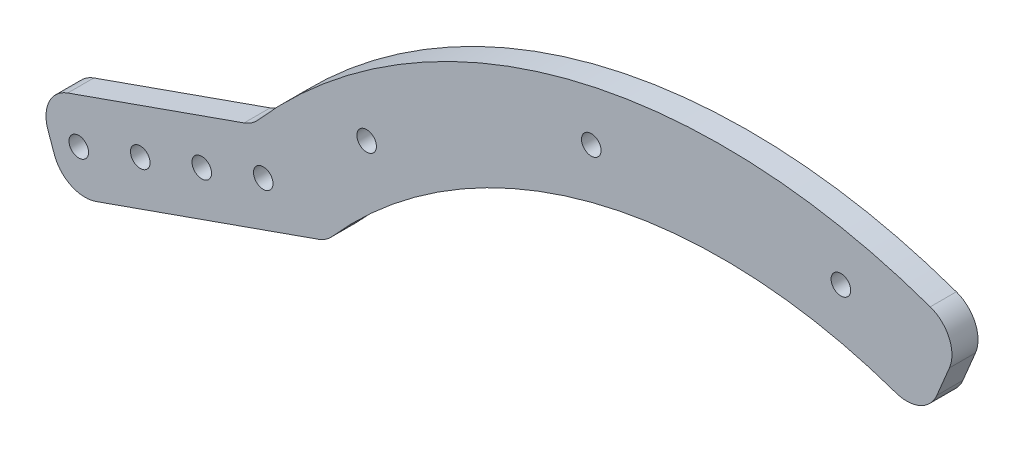
ISO-10303-21;
HEADER;
FILE_DESCRIPTION(('STEP AP214'),'2;1');
FILE_NAME('part.step','',(''),(''),'','','');
FILE_SCHEMA(('AUTOMOTIVE_DESIGN { 1 0 10303 214 1 1 1 1 }'));
ENDSEC;
DATA;
#1=APPLICATION_CONTEXT('core data for automotive mechanical design processes');
#2=APPLICATION_PROTOCOL_DEFINITION('international standard','automotive_design',2000,#1);
#3=PRODUCT_CONTEXT('',#1,'mechanical');
#4=PRODUCT('Part','Part','',(#3));
#5=PRODUCT_RELATED_PRODUCT_CATEGORY('part','',(#4));
#6=PRODUCT_DEFINITION_FORMATION('','',#4);
#7=PRODUCT_DEFINITION_CONTEXT('part definition',#1,'design');
#8=PRODUCT_DEFINITION('design','',#6,#7);
#9=PRODUCT_DEFINITION_SHAPE('','',#8);
#10=(LENGTH_UNIT() NAMED_UNIT(*) SI_UNIT(.MILLI.,.METRE.));
#11=(NAMED_UNIT(*) PLANE_ANGLE_UNIT() SI_UNIT($,.RADIAN.));
#12=(NAMED_UNIT(*) SI_UNIT($,.STERADIAN.) SOLID_ANGLE_UNIT());
#13=UNCERTAINTY_MEASURE_WITH_UNIT(LENGTH_MEASURE(1.E-05),#10,'distance_accuracy_value','');
#14=(GEOMETRIC_REPRESENTATION_CONTEXT(3) GLOBAL_UNCERTAINTY_ASSIGNED_CONTEXT((#13)) GLOBAL_UNIT_ASSIGNED_CONTEXT((#10,
#11,#12)) REPRESENTATION_CONTEXT('',''));
#15=CARTESIAN_POINT('',(0.,0.,0.));
#16=DIRECTION('',(0.,0.,1.));
#17=DIRECTION('',(1.,0.,0.));
#18=AXIS2_PLACEMENT_3D('',#15,#16,#17);
#19=CARTESIAN_POINT('',(-220.823144232662,61.9996075321783,8.));
#20=DIRECTION('',(0.942990333582889,0.332820117735138,0.));
#21=DIRECTION('',(-0.332820117735138,0.942990333582889,0.));
#22=AXIS2_PLACEMENT_3D('',#19,#20,#21);
#23=PLANE('',#22);
#24=DIRECTION('',(0.332820117735138,-0.942990333582889,0.));
#25=VECTOR('',#24,1.);
#26=CARTESIAN_POINT('',(-220.823144232662,61.9996075321783,0.));
#27=LINE('',#26,#25);
#28=CARTESIAN_POINT('',(-217.494943055311,52.5697041963494,0.));
#29=VERTEX_POINT('',#28);
#30=CARTESIAN_POINT('',(-215.504425104539,46.9299033358288,0.));
#31=VERTEX_POINT('',#30);
#32=EDGE_CURVE('E217',#29,#31,#27,.T.);
#33=ORIENTED_EDGE('',*,*,#32,.T.);
#34=DIRECTION('',(0.,0.,-1.));
#35=VECTOR('',#34,1.);
#36=CARTESIAN_POINT('',(-215.504425104539,46.9299033358288,8.));
#37=LINE('',#36,#35);
#38=CARTESIAN_POINT('',(-215.504425104539,46.9299033358288,8.));
#39=VERTEX_POINT('',#38);
#40=EDGE_CURVE('E196',#31,#39,#37,.F.);
#41=ORIENTED_EDGE('',*,*,#40,.T.);
#42=DIRECTION('',(0.332820117735138,-0.942990333582889,0.));
#43=VECTOR('',#42,1.);
#44=CARTESIAN_POINT('',(-220.823144232662,61.9996075321783,8.));
#45=LINE('',#44,#43);
#46=CARTESIAN_POINT('',(-217.494943055311,52.5697041963494,8.));
#47=VERTEX_POINT('',#46);
#48=EDGE_CURVE('E161',#47,#39,#45,.T.);
#49=ORIENTED_EDGE('',*,*,#48,.F.);
#50=DIRECTION('',(0.,0.,-1.));
#51=VECTOR('',#50,1.);
#52=CARTESIAN_POINT('',(-217.494943055311,52.5697041963494,8.));
#53=LINE('',#52,#51);
#54=EDGE_CURVE('E193',#47,#29,#53,.T.);
#55=ORIENTED_EDGE('',*,*,#54,.T.);
#56=EDGE_LOOP('',(#33,#41,#49,#55));
#57=FACE_BOUND('',#56,.T.);
#58=ADVANCED_FACE('F35',(#57),#23,.F.);
#59=CARTESIAN_POINT('',(-132.022045572642,65.7897100074866,8.));
#60=DIRECTION('',(-0.332820117735137,0.94299033358289,0.));
#61=DIRECTION('',(-0.94299033358289,-0.332820117735137,0.));
#62=AXIS2_PLACEMENT_3D('',#59,#60,#61);
#63=PLANE('',#62);
#64=DIRECTION('',(0.94299033358289,0.332820117735137,0.));
#65=VECTOR('',#64,1.);
#66=CARTESIAN_POINT('',(-132.022045572642,65.7897100074866,8.));
#67=LINE('',#66,#65);
#68=CARTESIAN_POINT('',(-202.746320591359,40.8282011773513,8.));
#69=VERTEX_POINT('',#68);
#70=CARTESIAN_POINT('',(-134.507826357793,64.9123756127273,8.));
#71=VERTEX_POINT('',#70);
#72=EDGE_CURVE('E235',#69,#71,#67,.T.);
#73=ORIENTED_EDGE('',*,*,#72,.F.);
#74=DIRECTION('',(0.,0.,-1.));
#75=VECTOR('',#74,1.);
#76=CARTESIAN_POINT('',(-202.746320591359,40.8282011773513,8.));
#77=LINE('',#76,#75);
#78=CARTESIAN_POINT('',(-202.746320591359,40.8282011773513,0.));
#79=VERTEX_POINT('',#78);
#80=EDGE_CURVE('E190',#69,#79,#77,.T.);
#81=ORIENTED_EDGE('',*,*,#80,.T.);
#82=DIRECTION('',(0.94299033358289,0.332820117735137,0.));
#83=VECTOR('',#82,1.);
#84=CARTESIAN_POINT('',(-132.022045572642,65.7897100074866,0.));
#85=LINE('',#84,#83);
#86=CARTESIAN_POINT('',(-134.507826357793,64.9123756127273,0.));
#87=VERTEX_POINT('',#86);
#88=EDGE_CURVE('E156',#79,#87,#85,.T.);
#89=ORIENTED_EDGE('',*,*,#88,.T.);
#90=DIRECTION('',(0.,0.,-1.));
#91=VECTOR('',#90,1.);
#92=CARTESIAN_POINT('',(-134.507826357793,64.9123756127273,8.));
#93=LINE('',#92,#91);
#94=EDGE_CURVE('E188',#87,#71,#93,.F.);
#95=ORIENTED_EDGE('',*,*,#94,.T.);
#96=EDGE_LOOP('',(#73,#81,#89,#95));
#97=FACE_BOUND('',#96,.T.);
#98=ADVANCED_FACE('F225',(#97),#63,.F.);
#99=CARTESIAN_POINT('',(-10.4659105901456,-38.2492540786534,8.));
#100=DIRECTION('',(0.,0.,-1.));
#101=DIRECTION('',(-1.,0.,0.));
#102=AXIS2_PLACEMENT_3D('',#99,#100,#101);
#103=CYLINDRICAL_SURFACE('',#102,160.);
#104=CARTESIAN_POINT('',(-10.4659105901456,-38.2492540786534,0.));
#105=DIRECTION('',(0.,0.,-1.));
#106=DIRECTION('',(1.,0.,0.));
#107=AXIS2_PLACEMENT_3D('',#104,#105,#106);
#108=CIRCLE('',#107,160.);
#109=CARTESIAN_POINT('',(-130.343667714851,67.7192475940144,0.));
#110=VERTEX_POINT('',#109);
#111=CARTESIAN_POINT('',(42.5977902386086,112.695251135536,0.));
#112=VERTEX_POINT('',#111);
#113=EDGE_CURVE('E151',#110,#112,#108,.T.);
#114=ORIENTED_EDGE('',*,*,#113,.T.);
#115=DIRECTION('',(0.,0.,-1.));
#116=VECTOR('',#115,1.);
#117=CARTESIAN_POINT('',(42.5977902386086,112.695251135536,8.));
#118=LINE('',#117,#116);
#119=CARTESIAN_POINT('',(42.5977902386086,112.695251135536,8.));
#120=VERTEX_POINT('',#119);
#121=EDGE_CURVE('E129',#112,#120,#118,.F.);
#122=ORIENTED_EDGE('',*,*,#121,.T.);
#123=CARTESIAN_POINT('',(-10.4659105901456,-38.2492540786534,8.));
#124=DIRECTION('',(0.,0.,-1.));
#125=DIRECTION('',(1.,0.,0.));
#126=AXIS2_PLACEMENT_3D('',#123,#124,#125);
#127=CIRCLE('',#126,160.);
#128=CARTESIAN_POINT('',(-130.343667714851,67.7192475940144,8.));
#129=VERTEX_POINT('',#128);
#130=EDGE_CURVE('E234',#129,#120,#127,.T.);
#131=ORIENTED_EDGE('',*,*,#130,.F.);
#132=DIRECTION('',(0.,0.,-1.));
#133=VECTOR('',#132,1.);
#134=CARTESIAN_POINT('',(-130.343667714851,67.7192475940144,8.));
#135=LINE('',#134,#133);
#136=EDGE_CURVE('E134',#129,#110,#135,.T.);
#137=ORIENTED_EDGE('',*,*,#136,.T.);
#138=EDGE_LOOP('',(#114,#122,#131,#137));
#139=FACE_BOUND('',#138,.T.);
#140=ADVANCED_FACE('F237',(#139),#103,.F.);
#141=CARTESIAN_POINT('',(51.3849935154415,109.312481006434,8.));
#142=DIRECTION('',(-0.922260844281795,0.386568150659919,0.));
#143=DIRECTION('',(-0.386568150659919,-0.922260844281795,0.));
#144=AXIS2_PLACEMENT_3D('',#141,#142,#143);
#145=PLANE('',#144);
#146=DIRECTION('',(0.386568150659919,0.922260844281795,0.));
#147=VECTOR('',#146,1.);
#148=CARTESIAN_POINT('',(51.3849935154415,109.312481006434,8.));
#149=LINE('',#148,#147);
#150=CARTESIAN_POINT('',(55.1368799832237,118.263601204824,8.));
#151=VERTEX_POINT('',#150);
#152=CARTESIAN_POINT('',(59.0088935037096,127.501316346068,8.));
#153=VERTEX_POINT('',#152);
#154=EDGE_CURVE('E144',#151,#153,#149,.T.);
#155=ORIENTED_EDGE('',*,*,#154,.F.);
#156=DIRECTION('',(0.,0.,-1.));
#157=VECTOR('',#156,1.);
#158=CARTESIAN_POINT('',(55.1368799832237,118.263601204824,8.));
#159=LINE('',#158,#157);
#160=CARTESIAN_POINT('',(55.1368799832237,118.263601204824,0.));
#161=VERTEX_POINT('',#160);
#162=EDGE_CURVE('E128',#151,#161,#159,.T.);
#163=ORIENTED_EDGE('',*,*,#162,.T.);
#164=DIRECTION('',(0.386568150659919,0.922260844281795,0.));
#165=VECTOR('',#164,1.);
#166=CARTESIAN_POINT('',(51.3849935154415,109.312481006434,0.));
#167=LINE('',#166,#165);
#168=CARTESIAN_POINT('',(59.0088935037096,127.501316346068,0.));
#169=VERTEX_POINT('',#168);
#170=EDGE_CURVE('E141',#161,#169,#167,.T.);
#171=ORIENTED_EDGE('',*,*,#170,.T.);
#172=DIRECTION('',(0.,0.,-1.));
#173=VECTOR('',#172,1.);
#174=CARTESIAN_POINT('',(59.0088935037096,127.501316346068,8.));
#175=LINE('',#174,#173);
#176=EDGE_CURVE('E146',#169,#153,#175,.F.);
#177=ORIENTED_EDGE('',*,*,#176,.T.);
#178=EDGE_LOOP('',(#155,#163,#171,#177));
#179=FACE_BOUND('',#178,.T.);
#180=ADVANCED_FACE('F140',(#179),#145,.F.);
#181=CARTESIAN_POINT('',(-10.4659105901456,-38.2492540786534,8.));
#182=DIRECTION('',(0.,0.,-1.));
#183=DIRECTION('',(-1.,0.,0.));
#184=AXIS2_PLACEMENT_3D('',#181,#182,#183);
#185=CYLINDRICAL_SURFACE('',#184,190.);
#186=CARTESIAN_POINT('',(-10.4659105901456,-38.2492540786534,8.));
#187=DIRECTION('',(0.,0.,1.));
#188=DIRECTION('',(1.,0.,0.));
#189=AXIS2_PLACEMENT_3D('',#186,#187,#188);
#190=CIRCLE('',#189,190.);
#191=CARTESIAN_POINT('',(53.133629263727,140.790122959963,8.));
#192=VERTEX_POINT('',#191);
#193=CARTESIAN_POINT('',(-153.125685299723,87.2425332216027,8.));
#194=VERTEX_POINT('',#193);
#195=EDGE_CURVE('E212',#192,#194,#190,.T.);
#196=ORIENTED_EDGE('',*,*,#195,.F.);
#197=DIRECTION('',(0.,0.,-1.));
#198=VECTOR('',#197,1.);
#199=CARTESIAN_POINT('',(53.133629263727,140.790122959963,8.));
#200=LINE('',#199,#198);
#201=CARTESIAN_POINT('',(53.133629263727,140.790122959963,0.));
#202=VERTEX_POINT('',#201);
#203=EDGE_CURVE('E185',#192,#202,#200,.T.);
#204=ORIENTED_EDGE('',*,*,#203,.T.);
#205=CARTESIAN_POINT('',(-10.4659105901456,-38.2492540786534,0.));
#206=DIRECTION('',(0.,0.,1.));
#207=DIRECTION('',(1.,0.,0.));
#208=AXIS2_PLACEMENT_3D('',#205,#206,#207);
#209=CIRCLE('',#208,190.);
#210=CARTESIAN_POINT('',(-153.125685299723,87.2425332216027,0.));
#211=VERTEX_POINT('',#210);
#212=EDGE_CURVE('E150',#202,#211,#209,.T.);
#213=ORIENTED_EDGE('',*,*,#212,.T.);
#214=DIRECTION('',(0.,0.,-1.));
#215=VECTOR('',#214,1.);
#216=CARTESIAN_POINT('',(-153.125685299723,87.2425332216028,8.));
#217=LINE('',#216,#215);
#218=EDGE_CURVE('E183',#211,#194,#217,.F.);
#219=ORIENTED_EDGE('',*,*,#218,.T.);
#220=EDGE_LOOP('',(#196,#204,#213,#219));
#221=FACE_BOUND('',#220,.T.);
#222=ADVANCED_FACE('F207',(#221),#185,.T.);
#223=CARTESIAN_POINT('',(-154.81382088186,85.297015773638,8.));
#224=DIRECTION('',(0.332820117735137,-0.94299033358289,0.));
#225=DIRECTION('',(0.94299033358289,0.332820117735137,0.));
#226=AXIS2_PLACEMENT_3D('',#223,#224,#225);
#227=PLANE('',#226);
#228=DIRECTION('',(-0.942990333582889,-0.332820117735137,0.));
#229=VECTOR('',#228,1.);
#230=CARTESIAN_POINT('',(-154.81382088186,85.297015773638,0.));
#231=LINE('',#230,#229);
#232=CARTESIAN_POINT('',(-157.305893317612,84.4174607963136,0.));
#233=VERTEX_POINT('',#232);
#234=CARTESIAN_POINT('',(-211.393240896833,65.3278087095297,0.));
#235=VERTEX_POINT('',#234);
#236=EDGE_CURVE('E154',#233,#235,#231,.T.);
#237=ORIENTED_EDGE('',*,*,#236,.T.);
#238=DIRECTION('',(0.,0.,-1.));
#239=VECTOR('',#238,1.);
#240=CARTESIAN_POINT('',(-211.393240896833,65.3278087095297,8.));
#241=LINE('',#240,#239);
#242=CARTESIAN_POINT('',(-211.393240896833,65.3278087095297,8.));
#243=VERTEX_POINT('',#242);
#244=EDGE_CURVE('E50',#235,#243,#241,.F.);
#245=ORIENTED_EDGE('',*,*,#244,.T.);
#246=DIRECTION('',(-0.942990333582889,-0.332820117735137,0.));
#247=VECTOR('',#246,1.);
#248=CARTESIAN_POINT('',(-154.81382088186,85.297015773638,8.));
#249=LINE('',#248,#247);
#250=CARTESIAN_POINT('',(-157.305893317612,84.4174607963136,8.));
#251=VERTEX_POINT('',#250);
#252=EDGE_CURVE('E162',#251,#243,#249,.T.);
#253=ORIENTED_EDGE('',*,*,#252,.F.);
#254=DIRECTION('',(0.,0.,1.));
#255=VECTOR('',#254,1.);
#256=CARTESIAN_POINT('',(-157.305893317612,84.4174607963136,0.));
#257=LINE('',#256,#255);
#258=EDGE_CURVE('E198',#251,#233,#257,.F.);
#259=ORIENTED_EDGE('',*,*,#258,.T.);
#260=EDGE_LOOP('',(#237,#245,#253,#259));
#261=FACE_BOUND('',#260,.T.);
#262=ADVANCED_FACE('F210',(#261),#227,.F.);
#263=CARTESIAN_POINT('',(-10.4659105901456,-38.2492540786534,8.));
#264=DIRECTION('',(0.,0.,1.));
#265=DIRECTION('',(1.,0.,0.));
#266=AXIS2_PLACEMENT_3D('',#263,#264,#265);
#267=PLANE('',#266);
#268=CARTESIAN_POINT('',(-119.723860621341,98.4537098796336,8.));
#269=DIRECTION('',(0.,0.,1.));
#270=DIRECTION('',(-1.,0.,0.));
#271=AXIS2_PLACEMENT_3D('',#268,#269,#270);
#272=CIRCLE('',#271,2.99999999999999);
#273=CARTESIAN_POINT('',(-122.723860621341,98.4537098796336,8.));
#274=VERTEX_POINT('',#273);
#275=EDGE_CURVE('E281',#274,#274,#272,.T.);
#276=ORIENTED_EDGE('',*,*,#275,.F.);
#277=EDGE_LOOP('',(#276));
#278=FACE_BOUND('',#277,.T.);
#279=CARTESIAN_POINT('',(-50.82887108065,131.842192363757,8.));
#280=DIRECTION('',(0.,0.,1.));
#281=DIRECTION('',(-1.,0.,0.));
#282=AXIS2_PLACEMENT_3D('',#279,#280,#281);
#283=CIRCLE('',#282,2.99999999999998);
#284=CARTESIAN_POINT('',(-53.82887108065,131.842192363757,8.));
#285=VERTEX_POINT('',#284);
#286=EDGE_CURVE('E275',#285,#285,#283,.T.);
#287=ORIENTED_EDGE('',*,*,#286,.F.);
#288=EDGE_LOOP('',(#287));
#289=FACE_BOUND('',#288,.T.);
#290=CARTESIAN_POINT('',(-151.433351062706,72.7143918898136,8.));
#291=DIRECTION('',(0.,0.,1.));
#292=DIRECTION('',(1.,0.,0.));
#293=AXIS2_PLACEMENT_3D('',#290,#291,#292);
#294=CIRCLE('',#293,2.99999999999999);
#295=CARTESIAN_POINT('',(-148.433351062706,72.7143918898136,8.));
#296=VERTEX_POINT('',#295);
#297=EDGE_CURVE('E269',#296,#296,#294,.T.);
#298=ORIENTED_EDGE('',*,*,#297,.F.);
#299=EDGE_LOOP('',(#298));
#300=FACE_BOUND('',#299,.T.);
#301=CARTESIAN_POINT('',(25.7220423783668,132.968245202082,8.));
#302=DIRECTION('',(0.,0.,1.));
#303=DIRECTION('',(1.,0.,0.));
#304=AXIS2_PLACEMENT_3D('',#301,#302,#303);
#305=CIRCLE('',#304,3.);
#306=CARTESIAN_POINT('',(28.7220423783668,132.968245202082,8.));
#307=VERTEX_POINT('',#306);
#308=EDGE_CURVE('E263',#307,#307,#305,.T.);
#309=ORIENTED_EDGE('',*,*,#308,.F.);
#310=EDGE_LOOP('',(#309));
#311=FACE_BOUND('',#310,.T.);
#312=CARTESIAN_POINT('',(-170.293157734363,66.0579895351108,8.));
#313=DIRECTION('',(0.,0.,1.));
#314=DIRECTION('',(1.,0.,0.));
#315=AXIS2_PLACEMENT_3D('',#312,#313,#314);
#316=CIRCLE('',#315,2.99999999999996);
#317=CARTESIAN_POINT('',(-167.293157734363,66.0579895351108,8.));
#318=VERTEX_POINT('',#317);
#319=EDGE_CURVE('E257',#318,#318,#316,.T.);
#320=ORIENTED_EDGE('',*,*,#319,.F.);
#321=EDGE_LOOP('',(#320));
#322=FACE_BOUND('',#321,.T.);
#323=CARTESIAN_POINT('',(-189.152964406021,59.4015871804081,8.));
#324=DIRECTION('',(0.,0.,1.));
#325=DIRECTION('',(1.,0.,0.));
#326=AXIS2_PLACEMENT_3D('',#323,#324,#325);
#327=CIRCLE('',#326,2.99999999999999);
#328=CARTESIAN_POINT('',(-186.152964406021,59.4015871804081,8.));
#329=VERTEX_POINT('',#328);
#330=EDGE_CURVE('E251',#329,#329,#327,.T.);
#331=ORIENTED_EDGE('',*,*,#330,.F.);
#332=EDGE_LOOP('',(#331));
#333=FACE_BOUND('',#332,.T.);
#334=CARTESIAN_POINT('',(-208.012771077679,52.7451848257054,8.));
#335=DIRECTION('',(0.,0.,1.));
#336=DIRECTION('',(1.,0.,0.));
#337=AXIS2_PLACEMENT_3D('',#334,#335,#336);
#338=CIRCLE('',#337,2.99999999999991);
#339=CARTESIAN_POINT('',(-205.012771077679,52.7451848257054,8.));
#340=VERTEX_POINT('',#339);
#341=EDGE_CURVE('E245',#340,#340,#338,.T.);
#342=ORIENTED_EDGE('',*,*,#341,.F.);
#343=EDGE_LOOP('',(#342));
#344=FACE_BOUND('',#343,.T.);
#345=ORIENTED_EDGE('',*,*,#130,.T.);
#346=CARTESIAN_POINT('',(45.9142715404057,122.129282711423,8.));
#347=DIRECTION('',(0.,0.,1.));
#348=DIRECTION('',(1.,0.,0.));
#349=AXIS2_PLACEMENT_3D('',#346,#347,#348);
#350=CIRCLE('',#349,10.);
#351=EDGE_CURVE('E181',#120,#151,#350,.T.);
#352=ORIENTED_EDGE('',*,*,#351,.T.);
#353=ORIENTED_EDGE('',*,*,#154,.T.);
#354=CARTESIAN_POINT('',(49.7862850608916,131.366997852667,8.));
#355=DIRECTION('',(0.,0.,1.));
#356=DIRECTION('',(1.,0.,0.));
#357=AXIS2_PLACEMENT_3D('',#354,#355,#356);
#358=CIRCLE('',#357,10.);
#359=EDGE_CURVE('E179',#153,#192,#358,.T.);
#360=ORIENTED_EDGE('',*,*,#359,.T.);
#361=ORIENTED_EDGE('',*,*,#195,.T.);
#362=CARTESIAN_POINT('',(-160.634094494964,93.8473641321425,8.));
#363=DIRECTION('',(0.,0.,1.));
#364=DIRECTION('',(1.,0.,0.));
#365=AXIS2_PLACEMENT_3D('',#362,#363,#364);
#366=CIRCLE('',#365,10.);
#367=EDGE_CURVE('E12',#194,#251,#366,.F.);
#368=ORIENTED_EDGE('',*,*,#367,.T.);
#369=ORIENTED_EDGE('',*,*,#252,.T.);
#370=CARTESIAN_POINT('',(-208.065039719482,55.8979053737008,8.));
#371=DIRECTION('',(0.,0.,1.));
#372=DIRECTION('',(1.,0.,0.));
#373=AXIS2_PLACEMENT_3D('',#370,#371,#372);
#374=CIRCLE('',#373,10.);
#375=EDGE_CURVE('E175',#243,#47,#374,.T.);
#376=ORIENTED_EDGE('',*,*,#375,.T.);
#377=ORIENTED_EDGE('',*,*,#48,.T.);
#378=CARTESIAN_POINT('',(-206.07452176871,50.2581045131802,8.));
#379=DIRECTION('',(0.,0.,1.));
#380=DIRECTION('',(1.,0.,0.));
#381=AXIS2_PLACEMENT_3D('',#378,#379,#380);
#382=CIRCLE('',#381,10.);
#383=EDGE_CURVE('E177',#39,#69,#382,.T.);
#384=ORIENTED_EDGE('',*,*,#383,.T.);
#385=ORIENTED_EDGE('',*,*,#72,.T.);
#386=CARTESIAN_POINT('',(-137.836027535145,74.3422789485561,8.));
#387=DIRECTION('',(0.,0.,1.));
#388=DIRECTION('',(1.,0.,0.));
#389=AXIS2_PLACEMENT_3D('',#386,#387,#388);
#390=CIRCLE('',#389,10.);
#391=EDGE_CURVE('E173',#71,#129,#390,.T.);
#392=ORIENTED_EDGE('',*,*,#391,.T.);
#393=EDGE_LOOP('',(#345,#352,#353,#360,#361,#368,#369,#376,#377,#384,#385,#392));
#394=FACE_BOUND('',#393,.T.);
#395=ADVANCED_FACE('F233',(#278,#289,#300,#311,#322,#333,#344,#394),#267,.T.);
#396=CARTESIAN_POINT('',(-10.4659105901456,-38.2492540786534,0.));
#397=DIRECTION('',(0.,0.,1.));
#398=DIRECTION('',(1.,0.,0.));
#399=AXIS2_PLACEMENT_3D('',#396,#397,#398);
#400=PLANE('',#399);
#401=ORIENTED_EDGE('',*,*,#170,.F.);
#402=CARTESIAN_POINT('',(45.9142715404057,122.129282711423,0.));
#403=DIRECTION('',(0.,0.,1.));
#404=DIRECTION('',(1.,0.,0.));
#405=AXIS2_PLACEMENT_3D('',#402,#403,#404);
#406=CIRCLE('',#405,10.);
#407=EDGE_CURVE('E124',#161,#112,#406,.F.);
#408=ORIENTED_EDGE('',*,*,#407,.T.);
#409=ORIENTED_EDGE('',*,*,#113,.F.);
#410=CARTESIAN_POINT('',(-137.836027535145,74.3422789485561,0.));
#411=DIRECTION('',(0.,0.,1.));
#412=DIRECTION('',(1.,0.,0.));
#413=AXIS2_PLACEMENT_3D('',#410,#411,#412);
#414=CIRCLE('',#413,10.);
#415=EDGE_CURVE('E145',#110,#87,#414,.F.);
#416=ORIENTED_EDGE('',*,*,#415,.T.);
#417=ORIENTED_EDGE('',*,*,#88,.F.);
#418=CARTESIAN_POINT('',(-206.07452176871,50.2581045131802,0.));
#419=DIRECTION('',(0.,0.,1.));
#420=DIRECTION('',(1.,0.,0.));
#421=AXIS2_PLACEMENT_3D('',#418,#419,#420);
#422=CIRCLE('',#421,10.);
#423=EDGE_CURVE('E167',#79,#31,#422,.F.);
#424=ORIENTED_EDGE('',*,*,#423,.T.);
#425=ORIENTED_EDGE('',*,*,#32,.F.);
#426=CARTESIAN_POINT('',(-208.065039719482,55.8979053737008,0.));
#427=DIRECTION('',(0.,0.,1.));
#428=DIRECTION('',(1.,0.,0.));
#429=AXIS2_PLACEMENT_3D('',#426,#427,#428);
#430=CIRCLE('',#429,10.);
#431=EDGE_CURVE('E165',#29,#235,#430,.F.);
#432=ORIENTED_EDGE('',*,*,#431,.T.);
#433=ORIENTED_EDGE('',*,*,#236,.F.);
#434=CARTESIAN_POINT('',(-160.634094494964,93.8473641321425,0.));
#435=DIRECTION('',(0.,0.,1.));
#436=DIRECTION('',(1.,0.,0.));
#437=AXIS2_PLACEMENT_3D('',#434,#435,#436);
#438=CIRCLE('',#437,10.);
#439=EDGE_CURVE('E43',#233,#211,#438,.T.);
#440=ORIENTED_EDGE('',*,*,#439,.T.);
#441=ORIENTED_EDGE('',*,*,#212,.F.);
#442=CARTESIAN_POINT('',(49.7862850608916,131.366997852667,0.));
#443=DIRECTION('',(0.,0.,1.));
#444=DIRECTION('',(1.,0.,0.));
#445=AXIS2_PLACEMENT_3D('',#442,#443,#444);
#446=CIRCLE('',#445,10.);
#447=EDGE_CURVE('E135',#202,#169,#446,.F.);
#448=ORIENTED_EDGE('',*,*,#447,.T.);
#449=EDGE_LOOP('',(#401,#408,#409,#416,#417,#424,#425,#432,#433,#440,#441,#448));
#450=FACE_BOUND('',#449,.T.);
#451=ADVANCED_FACE('F148',(#450),#400,.F.);
#452=CARTESIAN_POINT('',(-208.012771077679,52.7451848257054,-8.48528137423857));
#453=DIRECTION('',(0.,0.,1.));
#454=DIRECTION('',(1.,0.,0.));
#455=AXIS2_PLACEMENT_3D('',#452,#453,#454);
#456=CYLINDRICAL_SURFACE('',#455,2.99999999999991);
#457=CARTESIAN_POINT('',(-208.012771077679,52.7451848257054,0.200000000000001));
#458=DIRECTION('',(0.,0.,1.));
#459=DIRECTION('',(1.,0.,0.));
#460=AXIS2_PLACEMENT_3D('',#457,#458,#459);
#461=CIRCLE('',#460,2.99999999999991);
#462=CARTESIAN_POINT('',(-205.012771077679,52.7451848257054,0.200000000000001));
#463=VERTEX_POINT('',#462);
#464=EDGE_CURVE('E219',#463,#463,#461,.F.);
#465=ORIENTED_EDGE('',*,*,#464,.T.);
#466=EDGE_LOOP('',(#465));
#467=FACE_BOUND('',#466,.T.);
#468=ORIENTED_EDGE('',*,*,#341,.T.);
#469=EDGE_LOOP('',(#468));
#470=FACE_BOUND('',#469,.T.);
#471=ADVANCED_FACE('F302',(#467,#470),#456,.F.);
#472=CARTESIAN_POINT('',(-10.4659105901456,-38.2492540786534,0.2));
#473=DIRECTION('',(0.,0.,1.));
#474=DIRECTION('',(1.,0.,0.));
#475=AXIS2_PLACEMENT_3D('',#472,#473,#474);
#476=PLANE('',#475);
#477=ORIENTED_EDGE('',*,*,#464,.F.);
#478=EDGE_LOOP('',(#477));
#479=FACE_BOUND('',#478,.T.);
#480=ADVANCED_FACE('F304',(#479),#476,.T.);
#481=CARTESIAN_POINT('',(-189.152964406021,59.4015871804081,-8.48528137423857));
#482=DIRECTION('',(0.,0.,1.));
#483=DIRECTION('',(1.,0.,0.));
#484=AXIS2_PLACEMENT_3D('',#481,#482,#483);
#485=CYLINDRICAL_SURFACE('',#484,2.99999999999999);
#486=CARTESIAN_POINT('',(-189.152964406021,59.4015871804081,0.200000000000001));
#487=DIRECTION('',(0.,0.,1.));
#488=DIRECTION('',(1.,0.,0.));
#489=AXIS2_PLACEMENT_3D('',#486,#487,#488);
#490=CIRCLE('',#489,2.99999999999999);
#491=CARTESIAN_POINT('',(-186.152964406021,59.4015871804081,0.200000000000001));
#492=VERTEX_POINT('',#491);
#493=EDGE_CURVE('E248',#492,#492,#490,.F.);
#494=ORIENTED_EDGE('',*,*,#493,.T.);
#495=EDGE_LOOP('',(#494));
#496=FACE_BOUND('',#495,.T.);
#497=ORIENTED_EDGE('',*,*,#330,.T.);
#498=EDGE_LOOP('',(#497));
#499=FACE_BOUND('',#498,.T.);
#500=ADVANCED_FACE('F311',(#496,#499),#485,.F.);
#501=CARTESIAN_POINT('',(-10.4659105901456,-38.2492540786534,0.2));
#502=DIRECTION('',(0.,0.,1.));
#503=DIRECTION('',(1.,0.,0.));
#504=AXIS2_PLACEMENT_3D('',#501,#502,#503);
#505=PLANE('',#504);
#506=ORIENTED_EDGE('',*,*,#493,.F.);
#507=EDGE_LOOP('',(#506));
#508=FACE_BOUND('',#507,.T.);
#509=ADVANCED_FACE('F524',(#508),#505,.T.);
#510=CARTESIAN_POINT('',(-170.293157734363,66.0579895351108,-8.48528137423857));
#511=DIRECTION('',(0.,0.,1.));
#512=DIRECTION('',(1.,0.,0.));
#513=AXIS2_PLACEMENT_3D('',#510,#511,#512);
#514=CYLINDRICAL_SURFACE('',#513,2.99999999999996);
#515=CARTESIAN_POINT('',(-170.293157734363,66.0579895351108,0.200000000000001));
#516=DIRECTION('',(0.,0.,1.));
#517=DIRECTION('',(1.,0.,0.));
#518=AXIS2_PLACEMENT_3D('',#515,#516,#517);
#519=CIRCLE('',#518,2.99999999999996);
#520=CARTESIAN_POINT('',(-167.293157734363,66.0579895351108,0.200000000000001));
#521=VERTEX_POINT('',#520);
#522=EDGE_CURVE('E254',#521,#521,#519,.F.);
#523=ORIENTED_EDGE('',*,*,#522,.T.);
#524=EDGE_LOOP('',(#523));
#525=FACE_BOUND('',#524,.T.);
#526=ORIENTED_EDGE('',*,*,#319,.T.);
#527=EDGE_LOOP('',(#526));
#528=FACE_BOUND('',#527,.T.);
#529=ADVANCED_FACE('F514',(#525,#528),#514,.F.);
#530=CARTESIAN_POINT('',(-10.4659105901456,-38.2492540786534,0.2));
#531=DIRECTION('',(0.,0.,1.));
#532=DIRECTION('',(1.,0.,0.));
#533=AXIS2_PLACEMENT_3D('',#530,#531,#532);
#534=PLANE('',#533);
#535=ORIENTED_EDGE('',*,*,#522,.F.);
#536=EDGE_LOOP('',(#535));
#537=FACE_BOUND('',#536,.T.);
#538=ADVANCED_FACE('F504',(#537),#534,.T.);
#539=CARTESIAN_POINT('',(25.7220423783668,132.968245202082,-8.48528137423857));
#540=DIRECTION('',(0.,0.,1.));
#541=DIRECTION('',(1.,0.,0.));
#542=AXIS2_PLACEMENT_3D('',#539,#540,#541);
#543=CYLINDRICAL_SURFACE('',#542,3.);
#544=CARTESIAN_POINT('',(25.7220423783668,132.968245202082,0.200000000000001));
#545=DIRECTION('',(0.,0.,1.));
#546=DIRECTION('',(1.,0.,0.));
#547=AXIS2_PLACEMENT_3D('',#544,#545,#546);
#548=CIRCLE('',#547,3.);
#549=CARTESIAN_POINT('',(28.7220423783668,132.968245202082,0.200000000000001));
#550=VERTEX_POINT('',#549);
#551=EDGE_CURVE('E260',#550,#550,#548,.F.);
#552=ORIENTED_EDGE('',*,*,#551,.T.);
#553=EDGE_LOOP('',(#552));
#554=FACE_BOUND('',#553,.T.);
#555=ORIENTED_EDGE('',*,*,#308,.T.);
#556=EDGE_LOOP('',(#555));
#557=FACE_BOUND('',#556,.T.);
#558=ADVANCED_FACE('F494',(#554,#557),#543,.F.);
#559=CARTESIAN_POINT('',(-10.4659105901456,-38.2492540786534,0.2));
#560=DIRECTION('',(0.,0.,1.));
#561=DIRECTION('',(1.,0.,0.));
#562=AXIS2_PLACEMENT_3D('',#559,#560,#561);
#563=PLANE('',#562);
#564=ORIENTED_EDGE('',*,*,#551,.F.);
#565=EDGE_LOOP('',(#564));
#566=FACE_BOUND('',#565,.T.);
#567=ADVANCED_FACE('F484',(#566),#563,.T.);
#568=CARTESIAN_POINT('',(-151.433351062706,72.7143918898136,-8.48528137423857));
#569=DIRECTION('',(0.,0.,1.));
#570=DIRECTION('',(1.,0.,0.));
#571=AXIS2_PLACEMENT_3D('',#568,#569,#570);
#572=CYLINDRICAL_SURFACE('',#571,2.99999999999999);
#573=CARTESIAN_POINT('',(-151.433351062706,72.7143918898136,0.200000000000001));
#574=DIRECTION('',(0.,0.,1.));
#575=DIRECTION('',(1.,0.,0.));
#576=AXIS2_PLACEMENT_3D('',#573,#574,#575);
#577=CIRCLE('',#576,2.99999999999999);
#578=CARTESIAN_POINT('',(-148.433351062706,72.7143918898136,0.200000000000001));
#579=VERTEX_POINT('',#578);
#580=EDGE_CURVE('E266',#579,#579,#577,.F.);
#581=ORIENTED_EDGE('',*,*,#580,.T.);
#582=EDGE_LOOP('',(#581));
#583=FACE_BOUND('',#582,.T.);
#584=ORIENTED_EDGE('',*,*,#297,.T.);
#585=EDGE_LOOP('',(#584));
#586=FACE_BOUND('',#585,.T.);
#587=ADVANCED_FACE('F474',(#583,#586),#572,.F.);
#588=CARTESIAN_POINT('',(-10.4659105901456,-38.2492540786534,0.2));
#589=DIRECTION('',(0.,0.,1.));
#590=DIRECTION('',(1.,0.,0.));
#591=AXIS2_PLACEMENT_3D('',#588,#589,#590);
#592=PLANE('',#591);
#593=ORIENTED_EDGE('',*,*,#580,.F.);
#594=EDGE_LOOP('',(#593));
#595=FACE_BOUND('',#594,.T.);
#596=ADVANCED_FACE('F464',(#595),#592,.T.);
#597=CARTESIAN_POINT('',(-50.82887108065,131.842192363757,-8.48528137423857));
#598=DIRECTION('',(0.,0.,1.));
#599=DIRECTION('',(1.,0.,0.));
#600=AXIS2_PLACEMENT_3D('',#597,#598,#599);
#601=CYLINDRICAL_SURFACE('',#600,2.99999999999998);
#602=CARTESIAN_POINT('',(-50.82887108065,131.842192363757,0.200000000000001));
#603=DIRECTION('',(0.,0.,1.));
#604=DIRECTION('',(1.,0.,0.));
#605=AXIS2_PLACEMENT_3D('',#602,#603,#604);
#606=CIRCLE('',#605,2.99999999999998);
#607=CARTESIAN_POINT('',(-47.82887108065,131.842192363757,0.200000000000001));
#608=VERTEX_POINT('',#607);
#609=EDGE_CURVE('E272',#608,#608,#606,.F.);
#610=ORIENTED_EDGE('',*,*,#609,.T.);
#611=EDGE_LOOP('',(#610));
#612=FACE_BOUND('',#611,.T.);
#613=ORIENTED_EDGE('',*,*,#286,.T.);
#614=EDGE_LOOP('',(#613));
#615=FACE_BOUND('',#614,.T.);
#616=ADVANCED_FACE('F454',(#612,#615),#601,.F.);
#617=CARTESIAN_POINT('',(-10.4659105901456,-38.2492540786534,0.2));
#618=DIRECTION('',(0.,0.,1.));
#619=DIRECTION('',(1.,0.,0.));
#620=AXIS2_PLACEMENT_3D('',#617,#618,#619);
#621=PLANE('',#620);
#622=ORIENTED_EDGE('',*,*,#609,.F.);
#623=EDGE_LOOP('',(#622));
#624=FACE_BOUND('',#623,.T.);
#625=ADVANCED_FACE('F444',(#624),#621,.T.);
#626=CARTESIAN_POINT('',(-119.723860621341,98.4537098796336,-8.48528137423857));
#627=DIRECTION('',(0.,0.,1.));
#628=DIRECTION('',(1.,0.,0.));
#629=AXIS2_PLACEMENT_3D('',#626,#627,#628);
#630=CYLINDRICAL_SURFACE('',#629,2.99999999999999);
#631=CARTESIAN_POINT('',(-119.723860621341,98.4537098796336,0.200000000000001));
#632=DIRECTION('',(0.,0.,1.));
#633=DIRECTION('',(1.,0.,0.));
#634=AXIS2_PLACEMENT_3D('',#631,#632,#633);
#635=CIRCLE('',#634,2.99999999999999);
#636=CARTESIAN_POINT('',(-116.723860621341,98.4537098796336,0.200000000000001));
#637=VERTEX_POINT('',#636);
#638=EDGE_CURVE('E278',#637,#637,#635,.F.);
#639=ORIENTED_EDGE('',*,*,#638,.T.);
#640=EDGE_LOOP('',(#639));
#641=FACE_BOUND('',#640,.T.);
#642=ORIENTED_EDGE('',*,*,#275,.T.);
#643=EDGE_LOOP('',(#642));
#644=FACE_BOUND('',#643,.T.);
#645=ADVANCED_FACE('F285',(#641,#644),#630,.F.);
#646=CARTESIAN_POINT('',(-10.4659105901456,-38.2492540786534,0.2));
#647=DIRECTION('',(0.,0.,1.));
#648=DIRECTION('',(1.,0.,0.));
#649=AXIS2_PLACEMENT_3D('',#646,#647,#648);
#650=PLANE('',#649);
#651=ORIENTED_EDGE('',*,*,#638,.F.);
#652=EDGE_LOOP('',(#651));
#653=FACE_BOUND('',#652,.T.);
#654=ADVANCED_FACE('F327',(#653),#650,.T.);
#655=CARTESIAN_POINT('',(45.9142715404057,122.129282711423,8.));
#656=DIRECTION('',(0.,0.,-1.));
#657=DIRECTION('',(-1.,0.,0.));
#658=AXIS2_PLACEMENT_3D('',#655,#656,#657);
#659=CYLINDRICAL_SURFACE('',#658,10.);
#660=ORIENTED_EDGE('',*,*,#351,.F.);
#661=ORIENTED_EDGE('',*,*,#121,.F.);
#662=ORIENTED_EDGE('',*,*,#407,.F.);
#663=ORIENTED_EDGE('',*,*,#162,.F.);
#664=EDGE_LOOP('',(#660,#661,#662,#663));
#665=FACE_BOUND('',#664,.T.);
#666=ADVANCED_FACE('F127',(#665),#659,.T.);
#667=CARTESIAN_POINT('',(49.7862850608916,131.366997852667,8.));
#668=DIRECTION('',(0.,0.,-1.));
#669=DIRECTION('',(-1.,0.,0.));
#670=AXIS2_PLACEMENT_3D('',#667,#668,#669);
#671=CYLINDRICAL_SURFACE('',#670,10.);
#672=ORIENTED_EDGE('',*,*,#359,.F.);
#673=ORIENTED_EDGE('',*,*,#176,.F.);
#674=ORIENTED_EDGE('',*,*,#447,.F.);
#675=ORIENTED_EDGE('',*,*,#203,.F.);
#676=EDGE_LOOP('',(#672,#673,#674,#675));
#677=FACE_BOUND('',#676,.T.);
#678=ADVANCED_FACE('F326',(#677),#671,.T.);
#679=CARTESIAN_POINT('',(-206.07452176871,50.2581045131802,8.));
#680=DIRECTION('',(0.,0.,-1.));
#681=DIRECTION('',(-1.,0.,0.));
#682=AXIS2_PLACEMENT_3D('',#679,#680,#681);
#683=CYLINDRICAL_SURFACE('',#682,10.);
#684=ORIENTED_EDGE('',*,*,#383,.F.);
#685=ORIENTED_EDGE('',*,*,#40,.F.);
#686=ORIENTED_EDGE('',*,*,#423,.F.);
#687=ORIENTED_EDGE('',*,*,#80,.F.);
#688=EDGE_LOOP('',(#684,#685,#686,#687));
#689=FACE_BOUND('',#688,.T.);
#690=ADVANCED_FACE('F330',(#689),#683,.T.);
#691=CARTESIAN_POINT('',(-208.065039719482,55.8979053737008,8.));
#692=DIRECTION('',(0.,0.,-1.));
#693=DIRECTION('',(-1.,0.,0.));
#694=AXIS2_PLACEMENT_3D('',#691,#692,#693);
#695=CYLINDRICAL_SURFACE('',#694,10.);
#696=ORIENTED_EDGE('',*,*,#375,.F.);
#697=ORIENTED_EDGE('',*,*,#244,.F.);
#698=ORIENTED_EDGE('',*,*,#431,.F.);
#699=ORIENTED_EDGE('',*,*,#54,.F.);
#700=EDGE_LOOP('',(#696,#697,#698,#699));
#701=FACE_BOUND('',#700,.T.);
#702=ADVANCED_FACE('F334',(#701),#695,.T.);
#703=CARTESIAN_POINT('',(-160.634094494964,93.8473641321425,8.));
#704=DIRECTION('',(0.,0.,-1.));
#705=DIRECTION('',(-1.,0.,0.));
#706=AXIS2_PLACEMENT_3D('',#703,#704,#705);
#707=CYLINDRICAL_SURFACE('',#706,10.);
#708=ORIENTED_EDGE('',*,*,#367,.F.);
#709=ORIENTED_EDGE('',*,*,#218,.F.);
#710=ORIENTED_EDGE('',*,*,#439,.F.);
#711=ORIENTED_EDGE('',*,*,#258,.F.);
#712=EDGE_LOOP('',(#708,#709,#710,#711));
#713=FACE_BOUND('',#712,.T.);
#714=ADVANCED_FACE('F209',(#713),#707,.F.);
#715=CARTESIAN_POINT('',(-137.836027535145,74.3422789485561,8.));
#716=DIRECTION('',(0.,0.,-1.));
#717=DIRECTION('',(-1.,0.,0.));
#718=AXIS2_PLACEMENT_3D('',#715,#716,#717);
#719=CYLINDRICAL_SURFACE('',#718,10.);
#720=ORIENTED_EDGE('',*,*,#391,.F.);
#721=ORIENTED_EDGE('',*,*,#94,.F.);
#722=ORIENTED_EDGE('',*,*,#415,.F.);
#723=ORIENTED_EDGE('',*,*,#136,.F.);
#724=EDGE_LOOP('',(#720,#721,#722,#723));
#725=FACE_BOUND('',#724,.T.);
#726=ADVANCED_FACE('F37',(#725),#719,.T.);
#727=CLOSED_SHELL('',(#58,#98,#140,#180,#222,#262,#395,#451,#471,#480,#500,#509,#529,#538,#558,
#567,#587,#596,#616,#625,#645,#654,#666,#678,#690,#702,#714,#726));
#728=MANIFOLD_SOLID_BREP('B2',#727);
#729=ADVANCED_BREP_SHAPE_REPRESENTATION('',(#18,#728),#14);
#730=SHAPE_DEFINITION_REPRESENTATION(#9,#729);
ENDSEC;
END-ISO-10303-21;
